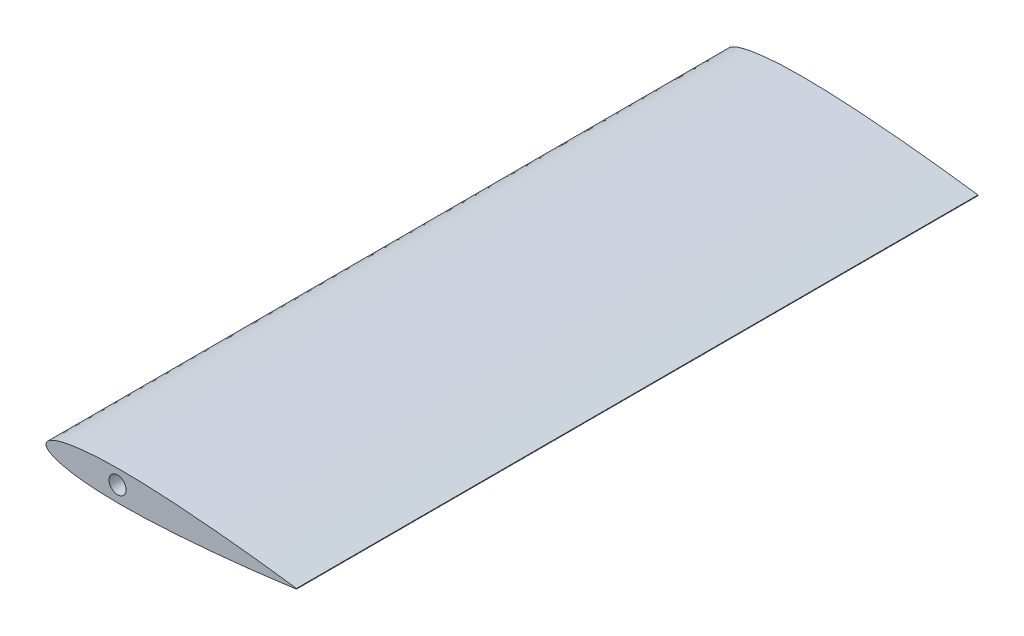
ISO-10303-21;
HEADER;
FILE_DESCRIPTION(('STEP AP214'),'2;1');
FILE_NAME('part.step','',(''),(''),'','','');
FILE_SCHEMA(('AUTOMOTIVE_DESIGN { 1 0 10303 214 1 1 1 1 }'));
ENDSEC;
DATA;
#1=APPLICATION_CONTEXT('core data for automotive mechanical design processes');
#2=APPLICATION_PROTOCOL_DEFINITION('international standard','automotive_design',2000,#1);
#3=PRODUCT_CONTEXT('',#1,'mechanical');
#4=PRODUCT('Part','Part','',(#3));
#5=PRODUCT_RELATED_PRODUCT_CATEGORY('part','',(#4));
#6=PRODUCT_DEFINITION_FORMATION('','',#4);
#7=PRODUCT_DEFINITION_CONTEXT('part definition',#1,'design');
#8=PRODUCT_DEFINITION('design','',#6,#7);
#9=PRODUCT_DEFINITION_SHAPE('','',#8);
#10=(LENGTH_UNIT() NAMED_UNIT(*) SI_UNIT(.MILLI.,.METRE.));
#11=(NAMED_UNIT(*) PLANE_ANGLE_UNIT() SI_UNIT($,.RADIAN.));
#12=(NAMED_UNIT(*) SI_UNIT($,.STERADIAN.) SOLID_ANGLE_UNIT());
#13=UNCERTAINTY_MEASURE_WITH_UNIT(LENGTH_MEASURE(1.E-05),#10,'distance_accuracy_value','');
#14=(GEOMETRIC_REPRESENTATION_CONTEXT(3) GLOBAL_UNCERTAINTY_ASSIGNED_CONTEXT((#13)) GLOBAL_UNIT_ASSIGNED_CONTEXT((#10,
#11,#12)) REPRESENTATION_CONTEXT('',''));
#15=CARTESIAN_POINT('',(0.,0.,0.));
#16=DIRECTION('',(0.,0.,1.));
#17=DIRECTION('',(1.,0.,0.));
#18=AXIS2_PLACEMENT_3D('',#15,#16,#17);
#19=CARTESIAN_POINT('',(0.999999999999996,-0.030492,80.));
#20=CARTESIAN_POINT('',(0.439107200362805,0.0482916430037762,80.));
#21=CARTESIAN_POINT('',(-1.67440318546743,0.334004631039862,80.));
#22=CARTESIAN_POINT('',(-4.61753075382217,0.68424044281171,80.));
#23=CARTESIAN_POINT('',(-8.13265648574757,1.04666058109571,80.));
#24=CARTESIAN_POINT('',(-10.7979695978863,1.28467991908706,80.));
#25=CARTESIAN_POINT('',(-13.3462125522033,1.47149098632113,80.));
#26=CARTESIAN_POINT('',(-15.4585233955373,1.59430214673583,80.));
#27=CARTESIAN_POINT('',(-17.5341249985783,1.67566708670534,80.));
#28=CARTESIAN_POINT('',(-19.5295919390187,1.70658812428436,80.));
#29=CARTESIAN_POINT('',(-21.218108072518,1.68277080165957,80.));
#30=CARTESIAN_POINT('',(-22.5984962646601,1.6201482803771,80.));
#31=CARTESIAN_POINT('',(-23.6814091095408,1.53967512026883,80.));
#32=CARTESIAN_POINT('',(-24.6713537677688,1.43217562844883,80.));
#33=CARTESIAN_POINT('',(-25.4326813593176,1.31828462141949,80.));
#34=CARTESIAN_POINT('',(-25.9876663950995,1.21315529065949,80.));
#35=CARTESIAN_POINT('',(-26.3624753496774,1.13107874990639,80.));
#36=CARTESIAN_POINT('',(-26.7077655636183,1.04362868292588,80.));
#37=CARTESIAN_POINT('',(-27.0227740532249,0.951196851540344,80.));
#38=CARTESIAN_POINT('',(-27.30680622529,0.854090221485334,80.));
#39=CARTESIAN_POINT('',(-27.5592563657164,0.752644177568336,80.));
#40=CARTESIAN_POINT('',(-27.779624737862,0.647151372552298,80.));
#41=CARTESIAN_POINT('',(-27.9674915113008,0.537831437340606,80.));
#42=CARTESIAN_POINT('',(-28.1226379229612,0.42486969062914,80.));
#43=CARTESIAN_POINT('',(-28.2447641879163,0.308080316766064,80.));
#44=CARTESIAN_POINT('',(-28.3335757952812,0.1871324708287,80.));
#45=CARTESIAN_POINT('',(-28.387875352133,0.0614349740101144,80.));
#46=CARTESIAN_POINT('',(-28.4059100610577,-0.0675360000000003,80.));
#47=CARTESIAN_POINT('',(-28.387875352133,-0.196506974010112,80.));
#48=CARTESIAN_POINT('',(-28.3335757952812,-0.322204470828704,80.));
#49=CARTESIAN_POINT('',(-28.2447641879163,-0.443152316766058,80.));
#50=CARTESIAN_POINT('',(-28.1226379229612,-0.559941690629147,80.));
#51=CARTESIAN_POINT('',(-27.9674915113008,-0.672903437340602,80.));
#52=CARTESIAN_POINT('',(-27.779624737862,-0.782223372552299,80.));
#53=CARTESIAN_POINT('',(-27.5592563657164,-0.887716177568338,80.));
#54=CARTESIAN_POINT('',(-27.30680622529,-0.989162221485334,80.));
#55=CARTESIAN_POINT('',(-27.0227740532249,-1.08626885154034,80.));
#56=CARTESIAN_POINT('',(-26.7077655636183,-1.17870068292588,80.));
#57=CARTESIAN_POINT('',(-26.3624753496774,-1.26615074990639,80.));
#58=CARTESIAN_POINT('',(-25.8453176345296,-1.37939915489957,80.));
#59=CARTESIAN_POINT('',(-25.1285876853691,-1.50394081739461,80.));
#60=CARTESIAN_POINT('',(-24.1885879902536,-1.62425936478125,80.));
#61=CARTESIAN_POINT('',(-22.9535044026313,-1.736332976136,80.));
#62=CARTESIAN_POINT('',(-21.4031558298524,-1.81515251551264,80.));
#63=CARTESIAN_POINT('',(-19.2995446770764,-1.84491037015484,80.));
#64=CARTESIAN_POINT('',(-17.0681292430447,-1.79876702122128,80.));
#65=CARTESIAN_POINT('',(-14.7563271985331,-1.69255987178564,80.));
#66=CARTESIAN_POINT('',(-12.6416051474833,-1.55811383616586,80.));
#67=CARTESIAN_POINT('',(-10.3295124754579,-1.37861378181494,80.));
#68=CARTESIAN_POINT('',(-8.30351639758221,-1.19440739049765,80.));
#69=CARTESIAN_POINT('',(-5.69237571783539,-0.932615266100081,80.));
#70=CARTESIAN_POINT('',(-3.10979309525262,-0.643787719924702,80.));
#71=CARTESIAN_POINT('',(-0.644324125665286,-0.330601025685573,80.));
#72=CARTESIAN_POINT('',(0.586969476350031,-0.162396473693552,80.));
#73=CARTESIAN_POINT('',(0.948583439323904,-0.111802028814434,80.));
#74=CARTESIAN_POINT('',(0.999999999999996,-0.10458,80.));
#75=B_SPLINE_CURVE_WITH_KNOTS('',3,(#19,#20,#21,#22,#23,#24,#25,#26,#27,#28,#29,#30,#31,#32,#33,
#34,#35,#36,#37,#38,#39,#40,#41,#42,#43,#44,#45,#46,#47,#48,#49,#50,#51,#52,#53,#54,#55,#56,#57,
#58,#59,#60,#61,#62,#63,#64,#65,#66,#67,#68,#69,#70,#71,#72,#73,#74),.UNSPECIFIED.,.F.,.F.,(4,1,
1,1,1,1,1,1,1,1,1,1,1,1,1,1,1,1,1,1,1,1,1,1,1,1,1,1,1,1,1,1,1,1,1,1,1,1,1,1,1,1,1,1,1,1,1,1,1,1,
1,1,1,4),(0.,0.0283429008690872,0.106722048517726,0.148306054540842,0.205171366742429,
0.240621400483931,0.276160573352716,0.311047092160121,0.344559265520828,0.376017570419826,
0.395537658905913,0.413698812078543,0.430349273099823,0.445356904422305,0.452209372098903,
0.458611567079498,0.46455404405062,0.470029850192537,0.475034902370301,0.479569141493347,
0.483636857140142,0.487250262770083,0.490431337960153,0.493218828079602,0.495674085869199,
0.497891368316545,0.5,0.502108631683455,0.504325914130801,0.506781171920398,0.509568662039847,
0.512749737229918,0.516363142859858,0.520430858506654,0.524965097629699,0.529970149807464,
0.53544595594938,0.541388432920502,0.547790627901097,0.561933980705176,0.577778558712574,
0.595202023801781,0.623982429580175,0.655440734479173,0.700464146399425,0.735649712925285,
0.771241831243212,0.806495956538878,0.851693945459158,0.873039495246583,0.937813387298575,
0.981728387914688,0.997401830647112,1.),.UNSPECIFIED.);
#76=DIRECTION('',(0.,0.,-1.));
#77=VECTOR('',#76,1.);
#78=SURFACE_OF_LINEAR_EXTRUSION('',#75,#77);
#79=CARTESIAN_POINT('',(0.999999999999996,-0.030492,0.));
#80=CARTESIAN_POINT('',(0.439107200362805,0.0482916430037762,0.));
#81=CARTESIAN_POINT('',(-1.67440318546743,0.334004631039862,0.));
#82=CARTESIAN_POINT('',(-4.61753075382217,0.68424044281171,0.));
#83=CARTESIAN_POINT('',(-8.13265648574757,1.04666058109571,0.));
#84=CARTESIAN_POINT('',(-10.7979695978863,1.28467991908706,0.));
#85=CARTESIAN_POINT('',(-13.3462125522033,1.47149098632113,0.));
#86=CARTESIAN_POINT('',(-15.4585233955373,1.59430214673583,0.));
#87=CARTESIAN_POINT('',(-17.5341249985783,1.67566708670534,0.));
#88=CARTESIAN_POINT('',(-19.5295919390187,1.70658812428436,0.));
#89=CARTESIAN_POINT('',(-21.218108072518,1.68277080165957,0.));
#90=CARTESIAN_POINT('',(-22.5984962646601,1.6201482803771,0.));
#91=CARTESIAN_POINT('',(-23.6814091095408,1.53967512026883,0.));
#92=CARTESIAN_POINT('',(-24.6713537677688,1.43217562844883,0.));
#93=CARTESIAN_POINT('',(-25.4326813593176,1.31828462141949,0.));
#94=CARTESIAN_POINT('',(-25.9876663950995,1.21315529065949,0.));
#95=CARTESIAN_POINT('',(-26.3624753496774,1.13107874990639,0.));
#96=CARTESIAN_POINT('',(-26.7077655636183,1.04362868292588,0.));
#97=CARTESIAN_POINT('',(-27.0227740532249,0.951196851540344,0.));
#98=CARTESIAN_POINT('',(-27.30680622529,0.854090221485334,0.));
#99=CARTESIAN_POINT('',(-27.5592563657164,0.752644177568336,0.));
#100=CARTESIAN_POINT('',(-27.779624737862,0.647151372552298,0.));
#101=CARTESIAN_POINT('',(-27.9674915113008,0.537831437340606,0.));
#102=CARTESIAN_POINT('',(-28.1226379229612,0.42486969062914,0.));
#103=CARTESIAN_POINT('',(-28.2447641879163,0.308080316766064,0.));
#104=CARTESIAN_POINT('',(-28.3335757952812,0.1871324708287,0.));
#105=CARTESIAN_POINT('',(-28.387875352133,0.0614349740101144,0.));
#106=CARTESIAN_POINT('',(-28.4059100610577,-0.0675360000000003,0.));
#107=CARTESIAN_POINT('',(-28.387875352133,-0.196506974010112,0.));
#108=CARTESIAN_POINT('',(-28.3335757952812,-0.322204470828704,0.));
#109=CARTESIAN_POINT('',(-28.2447641879163,-0.443152316766058,0.));
#110=CARTESIAN_POINT('',(-28.1226379229612,-0.559941690629147,0.));
#111=CARTESIAN_POINT('',(-27.9674915113008,-0.672903437340602,0.));
#112=CARTESIAN_POINT('',(-27.779624737862,-0.782223372552299,0.));
#113=CARTESIAN_POINT('',(-27.5592563657164,-0.887716177568338,0.));
#114=CARTESIAN_POINT('',(-27.30680622529,-0.989162221485334,0.));
#115=CARTESIAN_POINT('',(-27.0227740532249,-1.08626885154034,0.));
#116=CARTESIAN_POINT('',(-26.7077655636183,-1.17870068292588,0.));
#117=CARTESIAN_POINT('',(-26.3624753496774,-1.26615074990639,0.));
#118=CARTESIAN_POINT('',(-25.8453176345296,-1.37939915489957,0.));
#119=CARTESIAN_POINT('',(-25.1285876853691,-1.50394081739461,0.));
#120=CARTESIAN_POINT('',(-24.1885879902536,-1.62425936478125,0.));
#121=CARTESIAN_POINT('',(-22.9535044026313,-1.736332976136,0.));
#122=CARTESIAN_POINT('',(-21.4031558298524,-1.81515251551264,0.));
#123=CARTESIAN_POINT('',(-19.2995446770764,-1.84491037015484,0.));
#124=CARTESIAN_POINT('',(-17.0681292430447,-1.79876702122128,0.));
#125=CARTESIAN_POINT('',(-14.7563271985331,-1.69255987178564,0.));
#126=CARTESIAN_POINT('',(-12.6416051474833,-1.55811383616586,0.));
#127=CARTESIAN_POINT('',(-10.3295124754579,-1.37861378181494,0.));
#128=CARTESIAN_POINT('',(-8.30351639758221,-1.19440739049765,0.));
#129=CARTESIAN_POINT('',(-5.69237571783539,-0.932615266100081,0.));
#130=CARTESIAN_POINT('',(-3.10979309525262,-0.643787719924702,0.));
#131=CARTESIAN_POINT('',(-0.644324125665286,-0.330601025685573,0.));
#132=CARTESIAN_POINT('',(0.586969476350031,-0.162396473693552,0.));
#133=CARTESIAN_POINT('',(0.948583439323904,-0.111802028814434,0.));
#134=CARTESIAN_POINT('',(0.999999999999996,-0.10458,0.));
#135=B_SPLINE_CURVE_WITH_KNOTS('',3,(#79,#80,#81,#82,#83,#84,#85,#86,#87,#88,#89,#90,#91,#92,
#93,#94,#95,#96,#97,#98,#99,#100,#101,#102,#103,#104,#105,#106,#107,#108,#109,#110,#111,#112,
#113,#114,#115,#116,#117,#118,#119,#120,#121,#122,#123,#124,#125,#126,#127,#128,#129,#130,#131,
#132,#133,#134),.UNSPECIFIED.,.F.,.F.,(4,1,1,1,1,1,1,1,1,1,1,1,1,1,1,1,1,1,1,1,1,1,1,1,1,1,1,1,
1,1,1,1,1,1,1,1,1,1,1,1,1,1,1,1,1,1,1,1,1,1,1,1,1,4),(0.,0.0283429008690872,0.106722048517726,
0.148306054540842,0.205171366742429,0.240621400483931,0.276160573352716,0.311047092160121,
0.344559265520828,0.376017570419826,0.395537658905913,0.413698812078543,0.430349273099823,
0.445356904422305,0.452209372098903,0.458611567079498,0.46455404405062,0.470029850192537,
0.475034902370301,0.479569141493347,0.483636857140142,0.487250262770083,0.490431337960153,
0.493218828079602,0.495674085869199,0.497891368316545,0.5,0.502108631683455,0.504325914130801,
0.506781171920398,0.509568662039847,0.512749737229918,0.516363142859858,0.520430858506654,
0.524965097629699,0.529970149807464,0.53544595594938,0.541388432920502,0.547790627901097,
0.561933980705176,0.577778558712574,0.595202023801781,0.623982429580175,0.655440734479173,
0.700464146399425,0.735649712925285,0.771241831243212,0.806495956538878,0.851693945459158,
0.873039495246583,0.937813387298575,0.981728387914688,0.997401830647112,1.),.UNSPECIFIED.);
#136=CARTESIAN_POINT('',(0.999999999999996,-0.030492,0.));
#137=VERTEX_POINT('',#136);
#138=CARTESIAN_POINT('',(0.999999999999996,-0.10458,0.));
#139=VERTEX_POINT('',#138);
#140=EDGE_CURVE('E67',#137,#139,#135,.T.);
#141=ORIENTED_EDGE('',*,*,#140,.T.);
#142=DIRECTION('',(0.,0.,-1.));
#143=VECTOR('',#142,1.);
#144=CARTESIAN_POINT('',(0.999999999999996,-0.10458,80.));
#145=LINE('',#144,#143);
#146=CARTESIAN_POINT('',(0.999999999999996,-0.10458,80.));
#147=VERTEX_POINT('',#146);
#148=EDGE_CURVE('E11',#147,#139,#145,.T.);
#149=ORIENTED_EDGE('',*,*,#148,.F.);
#150=CARTESIAN_POINT('',(0.999999999999996,-0.030492,80.));
#151=VERTEX_POINT('',#150);
#152=EDGE_CURVE('E66',#151,#147,#75,.T.);
#153=ORIENTED_EDGE('',*,*,#152,.F.);
#154=DIRECTION('',(0.,0.,-1.));
#155=VECTOR('',#154,1.);
#156=CARTESIAN_POINT('',(0.999999999999996,-0.030492,80.));
#157=LINE('',#156,#155);
#158=EDGE_CURVE('E44',#151,#137,#157,.T.);
#159=ORIENTED_EDGE('',*,*,#158,.T.);
#160=EDGE_LOOP('',(#141,#149,#153,#159));
#161=FACE_BOUND('',#160,.T.);
#162=ADVANCED_FACE('F35',(#161),#78,.F.);
#163=CARTESIAN_POINT('',(0.999999999999996,-0.10458,80.));
#164=DIRECTION('',(-1.,0.,0.));
#165=DIRECTION('',(0.,0.,1.));
#166=AXIS2_PLACEMENT_3D('',#163,#164,#165);
#167=PLANE('',#166);
#168=DIRECTION('',(0.,1.,0.));
#169=VECTOR('',#168,1.);
#170=CARTESIAN_POINT('',(0.999999999999996,-0.10458,0.));
#171=LINE('',#170,#169);
#172=EDGE_CURVE('E59',#139,#137,#171,.T.);
#173=ORIENTED_EDGE('',*,*,#172,.T.);
#174=ORIENTED_EDGE('',*,*,#158,.F.);
#175=DIRECTION('',(0.,1.,0.));
#176=VECTOR('',#175,1.);
#177=CARTESIAN_POINT('',(0.999999999999996,-0.10458,80.));
#178=LINE('',#177,#176);
#179=EDGE_CURVE('E51',#147,#151,#178,.T.);
#180=ORIENTED_EDGE('',*,*,#179,.F.);
#181=ORIENTED_EDGE('',*,*,#148,.T.);
#182=EDGE_LOOP('',(#173,#174,#180,#181));
#183=FACE_BOUND('',#182,.T.);
#184=ADVANCED_FACE('F62',(#183),#167,.F.);
#185=CARTESIAN_POINT('',(-28.4,-0.0675359999999933,80.));
#186=DIRECTION('',(0.,0.,-1.));
#187=DIRECTION('',(-1.,0.,0.));
#188=AXIS2_PLACEMENT_3D('',#185,#186,#187);
#189=PLANE('',#188);
#190=CARTESIAN_POINT('',(-20.,0.,80.));
#191=DIRECTION('',(0.,0.,1.));
#192=DIRECTION('',(1.,0.,0.));
#193=AXIS2_PLACEMENT_3D('',#190,#191,#192);
#194=CIRCLE('',#193,1.);
#195=CARTESIAN_POINT('',(-19.,0.,80.));
#196=VERTEX_POINT('',#195);
#197=EDGE_CURVE('E74',#196,#196,#194,.T.);
#198=ORIENTED_EDGE('',*,*,#197,.F.);
#199=EDGE_LOOP('',(#198));
#200=FACE_BOUND('',#199,.T.);
#201=ORIENTED_EDGE('',*,*,#152,.T.);
#202=ORIENTED_EDGE('',*,*,#179,.T.);
#203=EDGE_LOOP('',(#201,#202));
#204=FACE_BOUND('',#203,.T.);
#205=ADVANCED_FACE('F94',(#200,#204),#189,.F.);
#206=CARTESIAN_POINT('',(-28.4,-0.0675359999999933,0.));
#207=DIRECTION('',(0.,0.,-1.));
#208=DIRECTION('',(-1.,0.,0.));
#209=AXIS2_PLACEMENT_3D('',#206,#207,#208);
#210=PLANE('',#209);
#211=CARTESIAN_POINT('',(-20.,0.,0.));
#212=DIRECTION('',(0.,0.,1.));
#213=DIRECTION('',(1.,0.,0.));
#214=AXIS2_PLACEMENT_3D('',#211,#212,#213);
#215=CIRCLE('',#214,1.);
#216=CARTESIAN_POINT('',(-19.,0.,0.));
#217=VERTEX_POINT('',#216);
#218=EDGE_CURVE('E71',#217,#217,#215,.T.);
#219=ORIENTED_EDGE('',*,*,#218,.T.);
#220=EDGE_LOOP('',(#219));
#221=FACE_BOUND('',#220,.T.);
#222=ORIENTED_EDGE('',*,*,#140,.F.);
#223=ORIENTED_EDGE('',*,*,#172,.F.);
#224=EDGE_LOOP('',(#222,#223));
#225=FACE_BOUND('',#224,.T.);
#226=ADVANCED_FACE('F70',(#221,#225),#210,.T.);
#227=CARTESIAN_POINT('',(-20.,0.,0.));
#228=DIRECTION('',(0.,0.,1.));
#229=DIRECTION('',(1.,0.,0.));
#230=AXIS2_PLACEMENT_3D('',#227,#228,#229);
#231=CYLINDRICAL_SURFACE('',#230,1.);
#232=ORIENTED_EDGE('',*,*,#218,.F.);
#233=EDGE_LOOP('',(#232));
#234=FACE_BOUND('',#233,.T.);
#235=ORIENTED_EDGE('',*,*,#197,.T.);
#236=EDGE_LOOP('',(#235));
#237=FACE_BOUND('',#236,.T.);
#238=ADVANCED_FACE('F92',(#234,#237),#231,.F.);
#239=CLOSED_SHELL('',(#162,#184,#205,#226,#238));
#240=MANIFOLD_SOLID_BREP('B2',#239);
#241=ADVANCED_BREP_SHAPE_REPRESENTATION('',(#18,#240),#14);
#242=SHAPE_DEFINITION_REPRESENTATION(#9,#241);
ENDSEC;
END-ISO-10303-21;
